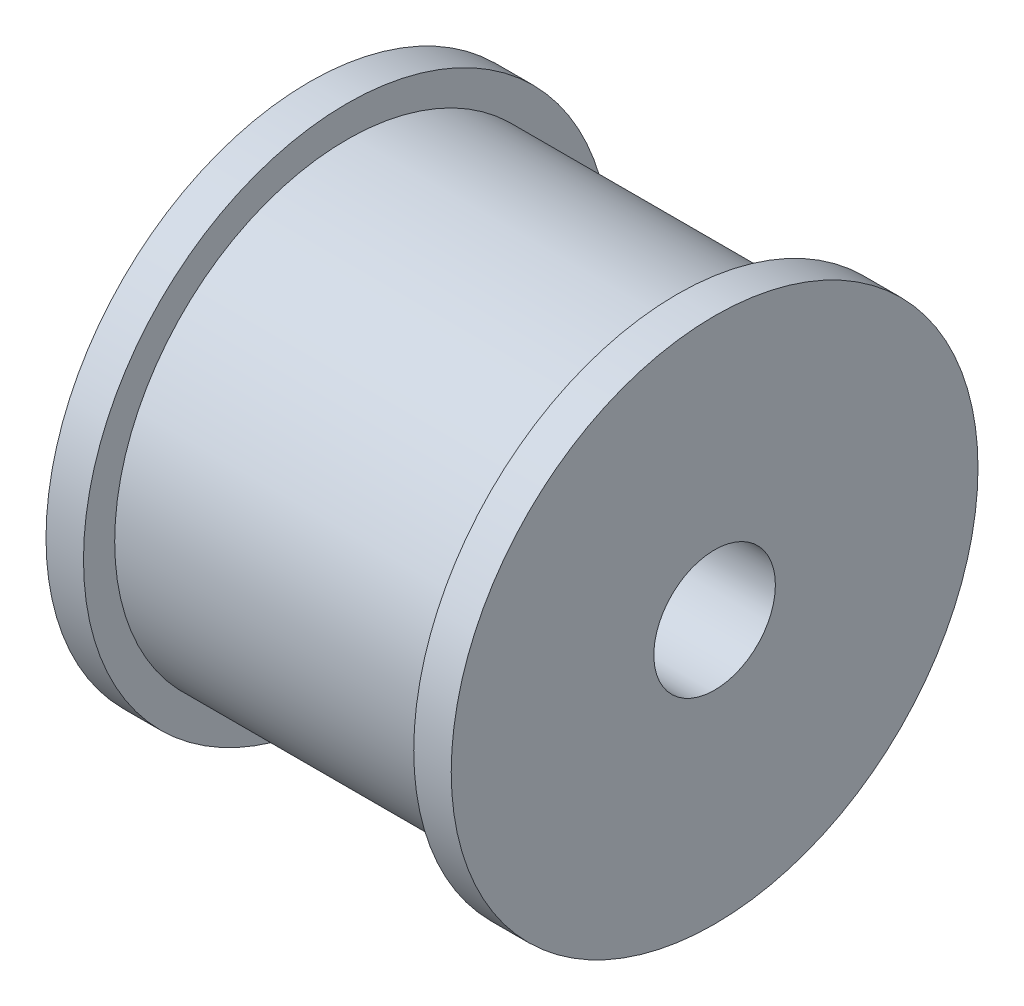
ISO-10303-21;
HEADER;
FILE_DESCRIPTION(('STEP AP214'),'2;1');
FILE_NAME('part.step','',(''),(''),'','','');
FILE_SCHEMA(('AUTOMOTIVE_DESIGN { 1 0 10303 214 1 1 1 1 }'));
ENDSEC;
DATA;
#1=APPLICATION_CONTEXT('core data for automotive mechanical design processes');
#2=APPLICATION_PROTOCOL_DEFINITION('international standard','automotive_design',2000,#1);
#3=PRODUCT_CONTEXT('',#1,'mechanical');
#4=PRODUCT('Part','Part','',(#3));
#5=PRODUCT_RELATED_PRODUCT_CATEGORY('part','',(#4));
#6=PRODUCT_DEFINITION_FORMATION('','',#4);
#7=PRODUCT_DEFINITION_CONTEXT('part definition',#1,'design');
#8=PRODUCT_DEFINITION('design','',#6,#7);
#9=PRODUCT_DEFINITION_SHAPE('','',#8);
#10=(LENGTH_UNIT() NAMED_UNIT(*) SI_UNIT(.MILLI.,.METRE.));
#11=(NAMED_UNIT(*) PLANE_ANGLE_UNIT() SI_UNIT($,.RADIAN.));
#12=(NAMED_UNIT(*) SI_UNIT($,.STERADIAN.) SOLID_ANGLE_UNIT());
#13=UNCERTAINTY_MEASURE_WITH_UNIT(LENGTH_MEASURE(1.E-05),#10,'distance_accuracy_value','');
#14=(GEOMETRIC_REPRESENTATION_CONTEXT(3) GLOBAL_UNCERTAINTY_ASSIGNED_CONTEXT((#13)) GLOBAL_UNIT_ASSIGNED_CONTEXT((#10,
#11,#12)) REPRESENTATION_CONTEXT('',''));
#15=CARTESIAN_POINT('',(0.,0.,0.));
#16=DIRECTION('',(0.,0.,1.));
#17=DIRECTION('',(1.,0.,0.));
#18=AXIS2_PLACEMENT_3D('',#15,#16,#17);
#19=CARTESIAN_POINT('',(-8.14999999999999,0.,11.46));
#20=DIRECTION('',(1.,0.,0.));
#21=DIRECTION('',(0.,0.,-1.));
#22=AXIS2_PLACEMENT_3D('',#19,#20,#21);
#23=PLANE('',#22);
#24=CARTESIAN_POINT('',(-8.14999999999999,0.,0.));
#25=DIRECTION('',(-1.,0.,0.));
#26=DIRECTION('',(0.,0.,1.));
#27=AXIS2_PLACEMENT_3D('',#24,#25,#26);
#28=CIRCLE('',#27,11.46);
#29=CARTESIAN_POINT('',(-8.14999999999999,0.,11.46));
#30=VERTEX_POINT('',#29);
#31=EDGE_CURVE('E53',#30,#30,#28,.T.);
#32=ORIENTED_EDGE('',*,*,#31,.T.);
#33=EDGE_LOOP('',(#32));
#34=FACE_BOUND('',#33,.T.);
#35=CARTESIAN_POINT('',(-8.14999999999999,0.,0.));
#36=DIRECTION('',(-1.,0.,0.));
#37=DIRECTION('',(0.,0.,1.));
#38=AXIS2_PLACEMENT_3D('',#35,#36,#37);
#39=CIRCLE('',#38,13.);
#40=CARTESIAN_POINT('',(-8.14999999999999,0.,13.));
#41=VERTEX_POINT('',#40);
#42=EDGE_CURVE('E10',#41,#41,#39,.T.);
#43=ORIENTED_EDGE('',*,*,#42,.F.);
#44=EDGE_LOOP('',(#43));
#45=FACE_BOUND('',#44,.T.);
#46=ADVANCED_FACE('F31',(#34,#45),#23,.T.);
#47=CARTESIAN_POINT('',(-10.,0.,0.));
#48=DIRECTION('',(-1.,0.,0.));
#49=DIRECTION('',(0.,0.,1.));
#50=AXIS2_PLACEMENT_3D('',#47,#48,#49);
#51=CYLINDRICAL_SURFACE('',#50,13.);
#52=ORIENTED_EDGE('',*,*,#42,.T.);
#53=EDGE_LOOP('',(#52));
#54=FACE_BOUND('',#53,.T.);
#55=CARTESIAN_POINT('',(-9.99999999999999,0.,0.));
#56=DIRECTION('',(-1.,0.,0.));
#57=DIRECTION('',(0.,0.,1.));
#58=AXIS2_PLACEMENT_3D('',#55,#56,#57);
#59=CIRCLE('',#58,13.);
#60=CARTESIAN_POINT('',(-9.99999999999999,0.,13.));
#61=VERTEX_POINT('',#60);
#62=EDGE_CURVE('E37',#61,#61,#59,.T.);
#63=ORIENTED_EDGE('',*,*,#62,.F.);
#64=EDGE_LOOP('',(#63));
#65=FACE_BOUND('',#64,.T.);
#66=ADVANCED_FACE('F92',(#54,#65),#51,.T.);
#67=CARTESIAN_POINT('',(-10.,0.,13.));
#68=DIRECTION('',(-1.,0.,0.));
#69=DIRECTION('',(0.,0.,1.));
#70=AXIS2_PLACEMENT_3D('',#67,#68,#69);
#71=PLANE('',#70);
#72=CARTESIAN_POINT('',(-10.,0.,0.));
#73=DIRECTION('',(-1.,0.,0.));
#74=DIRECTION('',(0.,0.,1.));
#75=AXIS2_PLACEMENT_3D('',#72,#73,#74);
#76=CIRCLE('',#75,2.99999999999999);
#77=CARTESIAN_POINT('',(-10.,0.,2.99999999999999));
#78=VERTEX_POINT('',#77);
#79=EDGE_CURVE('E56',#78,#78,#76,.T.);
#80=ORIENTED_EDGE('',*,*,#79,.F.);
#81=EDGE_LOOP('',(#80));
#82=FACE_BOUND('',#81,.T.);
#83=ORIENTED_EDGE('',*,*,#62,.T.);
#84=EDGE_LOOP('',(#83));
#85=FACE_BOUND('',#84,.T.);
#86=ADVANCED_FACE('F69',(#82,#85),#71,.T.);
#87=CARTESIAN_POINT('',(10.,0.,0.));
#88=DIRECTION('',(1.,0.,0.));
#89=DIRECTION('',(0.,0.,-1.));
#90=AXIS2_PLACEMENT_3D('',#87,#88,#89);
#91=PLANE('',#90);
#92=CARTESIAN_POINT('',(10.,0.,0.));
#93=DIRECTION('',(1.,0.,0.));
#94=DIRECTION('',(0.,0.,-1.));
#95=AXIS2_PLACEMENT_3D('',#92,#93,#94);
#96=CIRCLE('',#95,2.99999999999999);
#97=CARTESIAN_POINT('',(10.,0.,-2.99999999999999));
#98=VERTEX_POINT('',#97);
#99=EDGE_CURVE('E59',#98,#98,#96,.T.);
#100=ORIENTED_EDGE('',*,*,#99,.F.);
#101=EDGE_LOOP('',(#100));
#102=FACE_BOUND('',#101,.T.);
#103=CARTESIAN_POINT('',(10.,0.,0.));
#104=DIRECTION('',(-1.,0.,0.));
#105=DIRECTION('',(0.,0.,1.));
#106=AXIS2_PLACEMENT_3D('',#103,#104,#105);
#107=CIRCLE('',#106,13.);
#108=CARTESIAN_POINT('',(10.,0.,13.));
#109=VERTEX_POINT('',#108);
#110=EDGE_CURVE('E41',#109,#109,#107,.T.);
#111=ORIENTED_EDGE('',*,*,#110,.F.);
#112=EDGE_LOOP('',(#111));
#113=FACE_BOUND('',#112,.T.);
#114=ADVANCED_FACE('F65',(#102,#113),#91,.T.);
#115=CARTESIAN_POINT('',(-10.,0.,0.));
#116=DIRECTION('',(-1.,0.,0.));
#117=DIRECTION('',(0.,0.,1.));
#118=AXIS2_PLACEMENT_3D('',#115,#116,#117);
#119=CYLINDRICAL_SURFACE('',#118,13.);
#120=ORIENTED_EDGE('',*,*,#110,.T.);
#121=EDGE_LOOP('',(#120));
#122=FACE_BOUND('',#121,.T.);
#123=CARTESIAN_POINT('',(8.15,0.,0.));
#124=DIRECTION('',(-1.,0.,0.));
#125=DIRECTION('',(0.,0.,1.));
#126=AXIS2_PLACEMENT_3D('',#123,#124,#125);
#127=CIRCLE('',#126,13.);
#128=CARTESIAN_POINT('',(8.15,0.,13.));
#129=VERTEX_POINT('',#128);
#130=EDGE_CURVE('E45',#129,#129,#127,.T.);
#131=ORIENTED_EDGE('',*,*,#130,.F.);
#132=EDGE_LOOP('',(#131));
#133=FACE_BOUND('',#132,.T.);
#134=ADVANCED_FACE('F68',(#122,#133),#119,.T.);
#135=CARTESIAN_POINT('',(8.15,0.,13.));
#136=DIRECTION('',(-1.,0.,0.));
#137=DIRECTION('',(0.,0.,1.));
#138=AXIS2_PLACEMENT_3D('',#135,#136,#137);
#139=PLANE('',#138);
#140=ORIENTED_EDGE('',*,*,#130,.T.);
#141=EDGE_LOOP('',(#140));
#142=FACE_BOUND('',#141,.T.);
#143=CARTESIAN_POINT('',(8.15,0.,0.));
#144=DIRECTION('',(-1.,0.,0.));
#145=DIRECTION('',(0.,0.,1.));
#146=AXIS2_PLACEMENT_3D('',#143,#144,#145);
#147=CIRCLE('',#146,11.46);
#148=CARTESIAN_POINT('',(8.15,0.,11.46));
#149=VERTEX_POINT('',#148);
#150=EDGE_CURVE('E50',#149,#149,#147,.T.);
#151=ORIENTED_EDGE('',*,*,#150,.F.);
#152=EDGE_LOOP('',(#151));
#153=FACE_BOUND('',#152,.T.);
#154=ADVANCED_FACE('F75',(#142,#153),#139,.T.);
#155=CARTESIAN_POINT('',(-10.,0.,0.));
#156=DIRECTION('',(-1.,0.,0.));
#157=DIRECTION('',(0.,0.,1.));
#158=AXIS2_PLACEMENT_3D('',#155,#156,#157);
#159=CYLINDRICAL_SURFACE('',#158,11.46);
#160=ORIENTED_EDGE('',*,*,#150,.T.);
#161=EDGE_LOOP('',(#160));
#162=FACE_BOUND('',#161,.T.);
#163=ORIENTED_EDGE('',*,*,#31,.F.);
#164=EDGE_LOOP('',(#163));
#165=FACE_BOUND('',#164,.T.);
#166=ADVANCED_FACE('F81',(#162,#165),#159,.T.);
#167=CARTESIAN_POINT('',(10.,0.,0.));
#168=DIRECTION('',(1.,0.,0.));
#169=DIRECTION('',(0.,0.,-1.));
#170=AXIS2_PLACEMENT_3D('',#167,#168,#169);
#171=CYLINDRICAL_SURFACE('',#170,2.99999999999999);
#172=ORIENTED_EDGE('',*,*,#79,.T.);
#173=EDGE_LOOP('',(#172));
#174=FACE_BOUND('',#173,.T.);
#175=ORIENTED_EDGE('',*,*,#99,.T.);
#176=EDGE_LOOP('',(#175));
#177=FACE_BOUND('',#176,.T.);
#178=ADVANCED_FACE('F63',(#174,#177),#171,.F.);
#179=CLOSED_SHELL('',(#46,#66,#86,#114,#134,#154,#166,#178));
#180=MANIFOLD_SOLID_BREP('B2',#179);
#181=ADVANCED_BREP_SHAPE_REPRESENTATION('',(#18,#180),#14);
#182=SHAPE_DEFINITION_REPRESENTATION(#9,#181);
ENDSEC;
END-ISO-10303-21;
